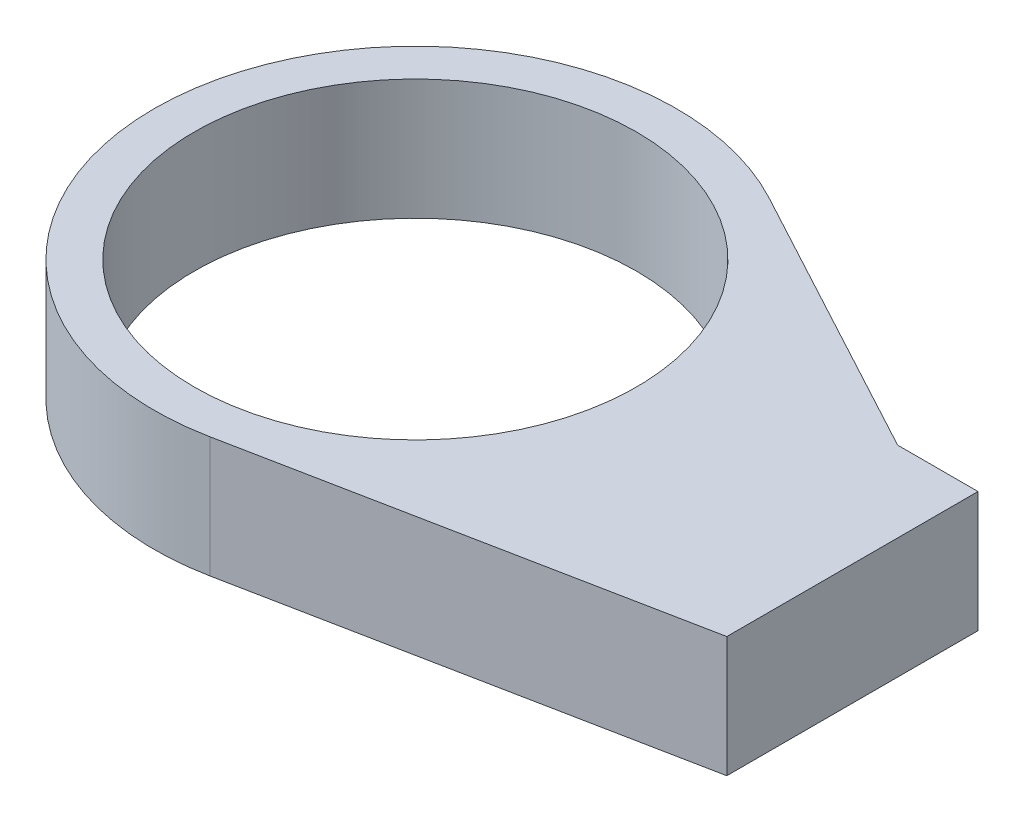
ISO-10303-21;
HEADER;
FILE_DESCRIPTION(('STEP AP214'),'2;1');
FILE_NAME('part.step','',(''),(''),'','','');
FILE_SCHEMA(('AUTOMOTIVE_DESIGN { 1 0 10303 214 1 1 1 1 }'));
ENDSEC;
DATA;
#1=APPLICATION_CONTEXT('core data for automotive mechanical design processes');
#2=APPLICATION_PROTOCOL_DEFINITION('international standard','automotive_design',2000,#1);
#3=PRODUCT_CONTEXT('',#1,'mechanical');
#4=PRODUCT('Part','Part','',(#3));
#5=PRODUCT_RELATED_PRODUCT_CATEGORY('part','',(#4));
#6=PRODUCT_DEFINITION_FORMATION('','',#4);
#7=PRODUCT_DEFINITION_CONTEXT('part definition',#1,'design');
#8=PRODUCT_DEFINITION('design','',#6,#7);
#9=PRODUCT_DEFINITION_SHAPE('','',#8);
#10=(LENGTH_UNIT() NAMED_UNIT(*) SI_UNIT(.MILLI.,.METRE.));
#11=(NAMED_UNIT(*) PLANE_ANGLE_UNIT() SI_UNIT($,.RADIAN.));
#12=(NAMED_UNIT(*) SI_UNIT($,.STERADIAN.) SOLID_ANGLE_UNIT());
#13=UNCERTAINTY_MEASURE_WITH_UNIT(LENGTH_MEASURE(1.E-05),#10,'distance_accuracy_value','');
#14=(GEOMETRIC_REPRESENTATION_CONTEXT(3) GLOBAL_UNCERTAINTY_ASSIGNED_CONTEXT((#13)) GLOBAL_UNIT_ASSIGNED_CONTEXT((#10,
#11,#12)) REPRESENTATION_CONTEXT('',''));
#15=CARTESIAN_POINT('',(0.,0.,0.));
#16=DIRECTION('',(0.,0.,1.));
#17=DIRECTION('',(1.,0.,0.));
#18=AXIS2_PLACEMENT_3D('',#15,#16,#17);
#19=CARTESIAN_POINT('',(0.,12.,0.));
#20=DIRECTION('',(0.,1.,0.));
#21=DIRECTION('',(0.,0.,1.));
#22=AXIS2_PLACEMENT_3D('',#19,#20,#21);
#23=PLANE('',#22);
#24=DIRECTION('',(0.,0.,-1.));
#25=VECTOR('',#24,1.);
#26=CARTESIAN_POINT('',(48.0000000000093,12.,-8.000000000208));
#27=LINE('',#26,#25);
#28=CARTESIAN_POINT('',(48.0000000000093,12.,17.0000000000468));
#29=VERTEX_POINT('',#28);
#30=CARTESIAN_POINT('',(48.0000000000093,12.,-8.000000000208));
#31=VERTEX_POINT('',#30);
#32=EDGE_CURVE('E117',#29,#31,#27,.T.);
#33=ORIENTED_EDGE('',*,*,#32,.T.);
#34=DIRECTION('',(-1.,0.,0.));
#35=VECTOR('',#34,1.);
#36=CARTESIAN_POINT('',(48.0000000000093,12.,-8.000000000208));
#37=LINE('',#36,#35);
#38=CARTESIAN_POINT('',(40.0000000001119,12.,-8.000000000208));
#39=VERTEX_POINT('',#38);
#40=EDGE_CURVE('E84',#31,#39,#37,.T.);
#41=ORIENTED_EDGE('',*,*,#40,.T.);
#42=DIRECTION('',(-0.880588156037297,0.,-0.473882368786635));
#43=VECTOR('',#42,1.);
#44=CARTESIAN_POINT('',(40.0000000001119,12.,-8.000000000208));
#45=LINE('',#44,#43);
#46=CARTESIAN_POINT('',(12.3209415884525,12.,-22.8952920569697));
#47=VERTEX_POINT('',#46);
#48=EDGE_CURVE('E88',#39,#47,#45,.T.);
#49=ORIENTED_EDGE('',*,*,#48,.T.);
#50=CARTESIAN_POINT('',(0.,12.,0.));
#51=DIRECTION('',(0.,1.,0.));
#52=DIRECTION('',(0.,0.,1.));
#53=AXIS2_PLACEMENT_3D('',#50,#51,#52);
#54=CIRCLE('',#53,26.);
#55=CARTESIAN_POINT('',(5.05039225503321,12.,25.504774809245));
#56=VERTEX_POINT('',#55);
#57=EDGE_CURVE('E92',#47,#56,#54,.T.);
#58=ORIENTED_EDGE('',*,*,#57,.T.);
#59=DIRECTION('',(0.980952877278655,0.,-0.194245855962815));
#60=VECTOR('',#59,1.);
#61=CARTESIAN_POINT('',(48.0000000000093,12.,17.0000000000468));
#62=LINE('',#61,#60);
#63=EDGE_CURVE('E50',#56,#29,#62,.T.);
#64=ORIENTED_EDGE('',*,*,#63,.T.);
#65=EDGE_LOOP('',(#33,#41,#49,#58,#64));
#66=FACE_BOUND('',#65,.T.);
#67=CARTESIAN_POINT('',(0.,12.,0.));
#68=DIRECTION('',(0.,1.,0.));
#69=DIRECTION('',(0.,0.,1.));
#70=AXIS2_PLACEMENT_3D('',#67,#68,#69);
#71=CIRCLE('',#70,22.);
#72=CARTESIAN_POINT('',(0.,12.,22.));
#73=VERTEX_POINT('',#72);
#74=EDGE_CURVE('E112',#73,#73,#71,.T.);
#75=ORIENTED_EDGE('',*,*,#74,.F.);
#76=EDGE_LOOP('',(#75));
#77=FACE_BOUND('',#76,.T.);
#78=ADVANCED_FACE('F33',(#66,#77),#23,.T.);
#79=CARTESIAN_POINT('',(0.,0.,0.));
#80=DIRECTION('',(0.,1.,0.));
#81=DIRECTION('',(0.,0.,1.));
#82=AXIS2_PLACEMENT_3D('',#79,#80,#81);
#83=PLANE('',#82);
#84=DIRECTION('',(0.,0.,-1.));
#85=VECTOR('',#84,1.);
#86=CARTESIAN_POINT('',(48.0000000000093,0.,-8.000000000208));
#87=LINE('',#86,#85);
#88=CARTESIAN_POINT('',(48.0000000000093,0.,17.0000000000468));
#89=VERTEX_POINT('',#88);
#90=CARTESIAN_POINT('',(48.0000000000093,0.,-8.000000000208));
#91=VERTEX_POINT('',#90);
#92=EDGE_CURVE('E108',#89,#91,#87,.T.);
#93=ORIENTED_EDGE('',*,*,#92,.F.);
#94=DIRECTION('',(0.980952877278655,0.,-0.194245855962815));
#95=VECTOR('',#94,1.);
#96=CARTESIAN_POINT('',(48.0000000000093,0.,17.0000000000468));
#97=LINE('',#96,#95);
#98=CARTESIAN_POINT('',(5.05039225503321,0.,25.504774809245));
#99=VERTEX_POINT('',#98);
#100=EDGE_CURVE('E76',#99,#89,#97,.T.);
#101=ORIENTED_EDGE('',*,*,#100,.F.);
#102=CARTESIAN_POINT('',(0.,0.,0.));
#103=DIRECTION('',(0.,1.,0.));
#104=DIRECTION('',(0.,0.,1.));
#105=AXIS2_PLACEMENT_3D('',#102,#103,#104);
#106=CIRCLE('',#105,26.);
#107=CARTESIAN_POINT('',(12.3209415884525,0.,-22.8952920569697));
#108=VERTEX_POINT('',#107);
#109=EDGE_CURVE('E70',#108,#99,#106,.T.);
#110=ORIENTED_EDGE('',*,*,#109,.F.);
#111=DIRECTION('',(-0.880588156037297,0.,-0.473882368786635));
#112=VECTOR('',#111,1.);
#113=CARTESIAN_POINT('',(40.0000000001119,0.,-8.000000000208));
#114=LINE('',#113,#112);
#115=CARTESIAN_POINT('',(40.0000000001119,0.,-8.000000000208));
#116=VERTEX_POINT('',#115);
#117=EDGE_CURVE('E99',#116,#108,#114,.T.);
#118=ORIENTED_EDGE('',*,*,#117,.F.);
#119=DIRECTION('',(-1.,0.,0.));
#120=VECTOR('',#119,1.);
#121=CARTESIAN_POINT('',(48.0000000000093,0.,-8.000000000208));
#122=LINE('',#121,#120);
#123=EDGE_CURVE('E111',#91,#116,#122,.T.);
#124=ORIENTED_EDGE('',*,*,#123,.F.);
#125=EDGE_LOOP('',(#93,#101,#110,#118,#124));
#126=FACE_BOUND('',#125,.T.);
#127=CARTESIAN_POINT('',(0.,0.,0.));
#128=DIRECTION('',(0.,1.,0.));
#129=DIRECTION('',(0.,0.,1.));
#130=AXIS2_PLACEMENT_3D('',#127,#128,#129);
#131=CIRCLE('',#130,22.);
#132=CARTESIAN_POINT('',(0.,0.,22.));
#133=VERTEX_POINT('',#132);
#134=EDGE_CURVE('E197',#133,#133,#131,.T.);
#135=ORIENTED_EDGE('',*,*,#134,.T.);
#136=EDGE_LOOP('',(#135));
#137=FACE_BOUND('',#136,.T.);
#138=ADVANCED_FACE('F121',(#126,#137),#83,.F.);
#139=CARTESIAN_POINT('',(48.0000000000093,12.,-8.000000000208));
#140=DIRECTION('',(-1.,0.,0.));
#141=DIRECTION('',(0.,0.,1.));
#142=AXIS2_PLACEMENT_3D('',#139,#140,#141);
#143=PLANE('',#142);
#144=ORIENTED_EDGE('',*,*,#92,.T.);
#145=DIRECTION('',(0.,-1.,0.));
#146=VECTOR('',#145,1.);
#147=CARTESIAN_POINT('',(48.0000000000093,12.,-8.000000000208));
#148=LINE('',#147,#146);
#149=EDGE_CURVE('E11',#31,#91,#148,.T.);
#150=ORIENTED_EDGE('',*,*,#149,.F.);
#151=ORIENTED_EDGE('',*,*,#32,.F.);
#152=DIRECTION('',(0.,-1.,0.));
#153=VECTOR('',#152,1.);
#154=CARTESIAN_POINT('',(48.0000000000093,12.,17.0000000000468));
#155=LINE('',#154,#153);
#156=EDGE_CURVE('E104',#29,#89,#155,.T.);
#157=ORIENTED_EDGE('',*,*,#156,.T.);
#158=EDGE_LOOP('',(#144,#150,#151,#157));
#159=FACE_BOUND('',#158,.T.);
#160=ADVANCED_FACE('F35',(#159),#143,.F.);
#161=CARTESIAN_POINT('',(48.0000000000093,12.,-8.000000000208));
#162=DIRECTION('',(0.,0.,1.));
#163=DIRECTION('',(1.,0.,0.));
#164=AXIS2_PLACEMENT_3D('',#161,#162,#163);
#165=PLANE('',#164);
#166=ORIENTED_EDGE('',*,*,#123,.T.);
#167=DIRECTION('',(0.,-1.,0.));
#168=VECTOR('',#167,1.);
#169=CARTESIAN_POINT('',(40.0000000001119,12.,-8.000000000208));
#170=LINE('',#169,#168);
#171=EDGE_CURVE('E42',#39,#116,#170,.T.);
#172=ORIENTED_EDGE('',*,*,#171,.F.);
#173=ORIENTED_EDGE('',*,*,#40,.F.);
#174=ORIENTED_EDGE('',*,*,#149,.T.);
#175=EDGE_LOOP('',(#166,#172,#173,#174));
#176=FACE_BOUND('',#175,.T.);
#177=ADVANCED_FACE('F146',(#176),#165,.F.);
#178=CARTESIAN_POINT('',(40.0000000001119,12.,-8.000000000208));
#179=DIRECTION('',(-0.473882368786635,0.,0.880588156037297));
#180=DIRECTION('',(0.880588156037297,0.,0.473882368786635));
#181=AXIS2_PLACEMENT_3D('',#178,#179,#180);
#182=PLANE('',#181);
#183=ORIENTED_EDGE('',*,*,#117,.T.);
#184=DIRECTION('',(0.,-1.,0.));
#185=VECTOR('',#184,1.);
#186=CARTESIAN_POINT('',(12.3209415884525,12.,-22.8952920569697));
#187=LINE('',#186,#185);
#188=EDGE_CURVE('E96',#47,#108,#187,.T.);
#189=ORIENTED_EDGE('',*,*,#188,.F.);
#190=ORIENTED_EDGE('',*,*,#48,.F.);
#191=ORIENTED_EDGE('',*,*,#171,.T.);
#192=EDGE_LOOP('',(#183,#189,#190,#191));
#193=FACE_BOUND('',#192,.T.);
#194=ADVANCED_FACE('F97',(#193),#182,.F.);
#195=CARTESIAN_POINT('',(0.,12.,0.));
#196=DIRECTION('',(0.,-1.,0.));
#197=DIRECTION('',(0.,0.,-1.));
#198=AXIS2_PLACEMENT_3D('',#195,#196,#197);
#199=CYLINDRICAL_SURFACE('',#198,26.);
#200=ORIENTED_EDGE('',*,*,#109,.T.);
#201=DIRECTION('',(0.,-1.,0.));
#202=VECTOR('',#201,1.);
#203=CARTESIAN_POINT('',(5.05039225503321,12.,25.504774809245));
#204=LINE('',#203,#202);
#205=EDGE_CURVE('E100',#56,#99,#204,.T.);
#206=ORIENTED_EDGE('',*,*,#205,.F.);
#207=ORIENTED_EDGE('',*,*,#57,.F.);
#208=ORIENTED_EDGE('',*,*,#188,.T.);
#209=EDGE_LOOP('',(#200,#206,#207,#208));
#210=FACE_BOUND('',#209,.T.);
#211=ADVANCED_FACE('F102',(#210),#199,.T.);
#212=CARTESIAN_POINT('',(48.0000000000093,12.,17.0000000000468));
#213=DIRECTION('',(-0.194245855962815,0.,-0.980952877278656));
#214=DIRECTION('',(-0.980952877278656,0.,0.194245855962816));
#215=AXIS2_PLACEMENT_3D('',#212,#213,#214);
#216=PLANE('',#215);
#217=ORIENTED_EDGE('',*,*,#100,.T.);
#218=ORIENTED_EDGE('',*,*,#156,.F.);
#219=ORIENTED_EDGE('',*,*,#63,.F.);
#220=ORIENTED_EDGE('',*,*,#205,.T.);
#221=EDGE_LOOP('',(#217,#218,#219,#220));
#222=FACE_BOUND('',#221,.T.);
#223=ADVANCED_FACE('F126',(#222),#216,.F.);
#224=CARTESIAN_POINT('',(0.,12.,0.));
#225=DIRECTION('',(0.,-1.,0.));
#226=DIRECTION('',(0.,0.,-1.));
#227=AXIS2_PLACEMENT_3D('',#224,#225,#226);
#228=CYLINDRICAL_SURFACE('',#227,22.);
#229=ORIENTED_EDGE('',*,*,#74,.T.);
#230=EDGE_LOOP('',(#229));
#231=FACE_BOUND('',#230,.T.);
#232=ORIENTED_EDGE('',*,*,#134,.F.);
#233=EDGE_LOOP('',(#232));
#234=FACE_BOUND('',#233,.T.);
#235=ADVANCED_FACE('F128',(#231,#234),#228,.F.);
#236=CLOSED_SHELL('',(#78,#138,#160,#177,#194,#211,#223,#235));
#237=MANIFOLD_SOLID_BREP('B2',#236);
#238=ADVANCED_BREP_SHAPE_REPRESENTATION('',(#18,#237),#14);
#239=SHAPE_DEFINITION_REPRESENTATION(#9,#238);
ENDSEC;
END-ISO-10303-21;
